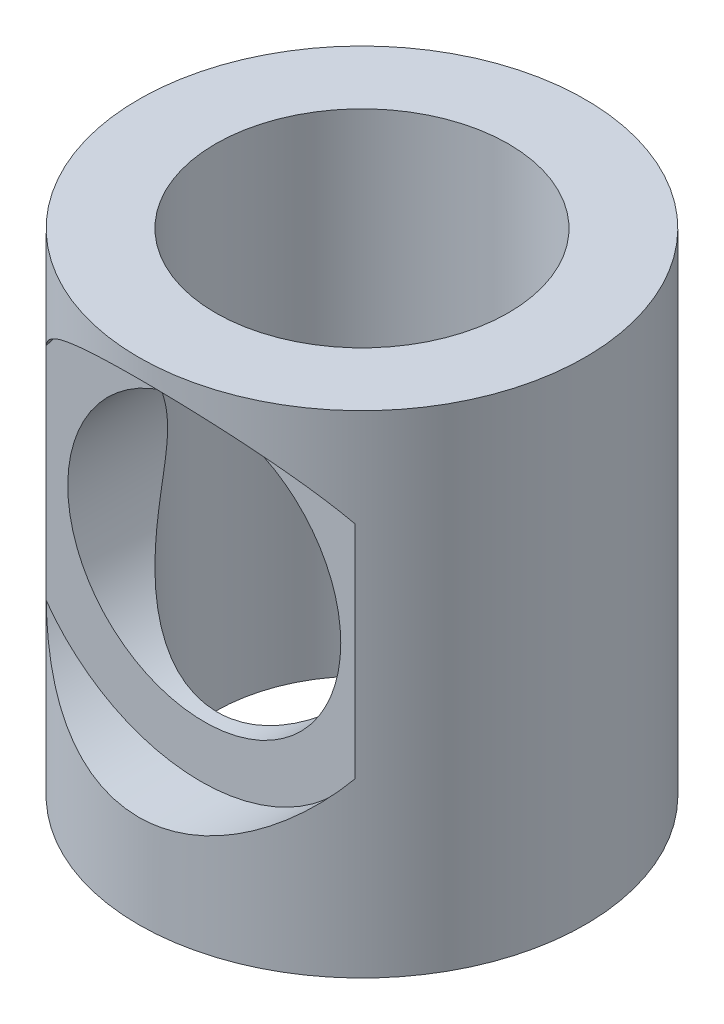
ISO-10303-21;
HEADER;
FILE_DESCRIPTION(('STEP AP214'),'2;1');
FILE_NAME('part.step','',(''),(''),'','','');
FILE_SCHEMA(('AUTOMOTIVE_DESIGN { 1 0 10303 214 1 1 1 1 }'));
ENDSEC;
DATA;
#1=APPLICATION_CONTEXT('core data for automotive mechanical design processes');
#2=APPLICATION_PROTOCOL_DEFINITION('international standard','automotive_design',2000,#1);
#3=PRODUCT_CONTEXT('',#1,'mechanical');
#4=PRODUCT('Part','Part','',(#3));
#5=PRODUCT_RELATED_PRODUCT_CATEGORY('part','',(#4));
#6=PRODUCT_DEFINITION_FORMATION('','',#4);
#7=PRODUCT_DEFINITION_CONTEXT('part definition',#1,'design');
#8=PRODUCT_DEFINITION('design','',#6,#7);
#9=PRODUCT_DEFINITION_SHAPE('','',#8);
#10=(LENGTH_UNIT() NAMED_UNIT(*) SI_UNIT(.MILLI.,.METRE.));
#11=(NAMED_UNIT(*) PLANE_ANGLE_UNIT() SI_UNIT($,.RADIAN.));
#12=(NAMED_UNIT(*) SI_UNIT($,.STERADIAN.) SOLID_ANGLE_UNIT());
#13=UNCERTAINTY_MEASURE_WITH_UNIT(LENGTH_MEASURE(1.E-05),#10,'distance_accuracy_value','');
#14=(GEOMETRIC_REPRESENTATION_CONTEXT(3) GLOBAL_UNCERTAINTY_ASSIGNED_CONTEXT((#13)) GLOBAL_UNIT_ASSIGNED_CONTEXT((#10,
#11,#12)) REPRESENTATION_CONTEXT('',''));
#15=CARTESIAN_POINT('',(0.,0.,0.));
#16=DIRECTION('',(0.,0.,1.));
#17=DIRECTION('',(1.,0.,0.));
#18=AXIS2_PLACEMENT_3D('',#15,#16,#17);
#19=CARTESIAN_POINT('',(0.,-19.8,0.));
#20=DIRECTION('',(0.,1.,0.));
#21=DIRECTION('',(0.,0.,1.));
#22=AXIS2_PLACEMENT_3D('',#19,#20,#21);
#23=CYLINDRICAL_SURFACE('',#22,5.9);
#24=CARTESIAN_POINT('',(0.,-19.8,0.));
#25=DIRECTION('',(0.,1.,0.));
#26=DIRECTION('',(0.,0.,1.));
#27=AXIS2_PLACEMENT_3D('',#24,#25,#26);
#28=CIRCLE('',#27,5.9);
#29=CARTESIAN_POINT('',(0.,-19.8,5.9));
#30=VERTEX_POINT('',#29);
#31=EDGE_CURVE('E79',#30,#30,#28,.T.);
#32=ORIENTED_EDGE('',*,*,#31,.F.);
#33=EDGE_LOOP('',(#32));
#34=FACE_BOUND('',#33,.T.);
#35=CARTESIAN_POINT('',(0.,0.,0.));
#36=DIRECTION('',(0.,1.,0.));
#37=DIRECTION('',(0.,0.,1.));
#38=AXIS2_PLACEMENT_3D('',#35,#36,#37);
#39=CIRCLE('',#38,5.9);
#40=CARTESIAN_POINT('',(0.,0.,5.9));
#41=VERTEX_POINT('',#40);
#42=EDGE_CURVE('E76',#41,#41,#39,.T.);
#43=ORIENTED_EDGE('',*,*,#42,.T.);
#44=EDGE_LOOP('',(#43));
#45=FACE_BOUND('',#44,.T.);
#46=CARTESIAN_POINT('',(0.,-13.8980757264155,5.9));
#47=CARTESIAN_POINT('',(-0.126691390947467,-13.8947225584826,5.89999903100118));
#48=CARTESIAN_POINT('',(-0.253283101886937,-13.8869831277355,5.89591047329306));
#49=CARTESIAN_POINT('',(-0.505172197858989,-13.8628453528029,5.87968911101895));
#50=CARTESIAN_POINT('',(-0.630468852261912,-13.8464423666288,5.86755199309081));
#51=CARTESIAN_POINT('',(-0.878877969457032,-13.8052359922776,5.83551906602363));
#52=CARTESIAN_POINT('',(-1.0019864227693,-13.7804185812953,5.81561029683759));
#53=CARTESIAN_POINT('',(-1.24494416961968,-13.7228122654682,5.76848668659436));
#54=CARTESIAN_POINT('',(-1.36479187193238,-13.6900195436375,5.74126834652262));
#55=CARTESIAN_POINT('',(-1.5994993378932,-13.6172822427277,5.68033305523673));
#56=CARTESIAN_POINT('',(-1.71439084594245,-13.5773957633308,5.64666873831866));
#57=CARTESIAN_POINT('',(-1.93962666386801,-13.4908666705345,5.57332039064358));
#58=CARTESIAN_POINT('',(-2.04996927600559,-13.4442215634841,5.53363413778766));
#59=CARTESIAN_POINT('',(-2.37342839938266,-13.2950387207805,5.40651455204672));
#60=CARTESIAN_POINT('',(-2.57919622538723,-13.1831837187117,5.31096141279213));
#61=CARTESIAN_POINT('',(-2.91147259148078,-12.9750932471056,5.1339745229345));
#62=CARTESIAN_POINT('',(-3.0435030636337,-12.8839273823971,5.05664340791624));
#63=CARTESIAN_POINT('',(-3.29664336667831,-12.6926624994763,4.89536861163123));
#64=CARTESIAN_POINT('',(-3.41775234376699,-12.592562784063,4.81142441433707));
#65=CARTESIAN_POINT('',(-3.64931102085374,-12.3842095670769,4.63826423635226));
#66=CARTESIAN_POINT('',(-3.75973329166726,-12.2759362903161,4.54903559049138));
#67=CARTESIAN_POINT('',(-3.96973078717574,-12.0522056789811,4.36698286270553));
#68=CARTESIAN_POINT('',(-4.06930758591977,-11.9367493907396,4.27415930518318));
#69=CARTESIAN_POINT('',(-4.26013854697353,-11.6961669363625,4.08409036890311));
#70=CARTESIAN_POINT('',(-4.351128096397,-11.5708728767048,3.98679238231184));
#71=CARTESIAN_POINT('',(-4.5221398232079,-11.3132924915922,3.79171109998188));
#72=CARTESIAN_POINT('',(-4.60215846382999,-11.181003930228,3.69392765822147));
#73=CARTESIAN_POINT('',(-4.751105074448,-10.9094687707432,3.50026870357882));
#74=CARTESIAN_POINT('',(-4.82005535477877,-10.7702369303474,3.40438970288198));
#75=CARTESIAN_POINT('',(-4.94686434303035,-10.4838860329348,3.21733814288459));
#76=CARTESIAN_POINT('',(-5.00473144274456,-10.3367730521149,3.1261620612281));
#77=CARTESIAN_POINT('',(-5.10571315081887,-10.0424777774662,2.95815786242724));
#78=CARTESIAN_POINT('',(-5.1495100349538,-9.89584175114157,2.88079475682739));
#79=CARTESIAN_POINT('',(-5.22580654239033,-9.59315599461952,2.73995305396068));
#80=CARTESIAN_POINT('',(-5.25831937107675,-9.43711752062542,2.67645825952442));
#81=CARTESIAN_POINT('',(-5.30590206101214,-9.14219803289837,2.58066096353428));
#82=CARTESIAN_POINT('',(-5.32297825376607,-9.00480404442875,2.54491999429473));
#83=CARTESIAN_POINT('',(-5.34666640536932,-8.72541924559101,2.4947905696136));
#84=CARTESIAN_POINT('',(-5.35330523879007,-8.58344120472219,2.48034728194494));
#85=CARTESIAN_POINT('',(-5.3554380120879,-8.29840337038994,2.47574170447133));
#86=CARTESIAN_POINT('',(-5.35088724158274,-8.15534152168419,2.48567682331633));
#87=CARTESIAN_POINT('',(-5.33107684364997,-7.87322667224227,2.52786913650411));
#88=CARTESIAN_POINT('',(-5.31579236054983,-7.73418375762343,2.56017813882537));
#89=CARTESIAN_POINT('',(-5.26568803091204,-7.39396199152114,2.66214822610583));
#90=CARTESIAN_POINT('',(-5.22489652888435,-7.19694504315974,2.74243735681371));
#91=CARTESIAN_POINT('',(-5.15050018678506,-6.91261796838828,2.87838505710499));
#92=CARTESIAN_POINT('',(-5.1234155926985,-6.81949022492552,2.92642616484271));
#93=CARTESIAN_POINT('',(-5.06506210570554,-6.63662768357758,3.02629776669884));
#94=CARTESIAN_POINT('',(-5.03379423836005,-6.54689206098208,3.07812733064038));
#95=CARTESIAN_POINT('',(-4.93794034574231,-6.29277716334701,3.23119272709259));
#96=CARTESIAN_POINT('',(-4.86827349304077,-6.13229980667728,3.33572052318314));
#97=CARTESIAN_POINT('',(-4.7152872999393,-5.82064009200175,3.54870847502938));
#98=CARTESIAN_POINT('',(-4.63195743463648,-5.66946502419048,3.65717161170366));
#99=CARTESIAN_POINT('',(-4.45172407683618,-5.37586370996478,3.87454334546886));
#100=CARTESIAN_POINT('',(-4.35482509527568,-5.23343457858228,3.98345178288984));
#101=CARTESIAN_POINT('',(-4.14728300878044,-4.95732271290564,4.19910025047437));
#102=CARTESIAN_POINT('',(-4.03664633589044,-4.82363592983401,4.305841268398));
#103=CARTESIAN_POINT('',(-3.82225060262293,-4.58847312546911,4.49634739953033));
#104=CARTESIAN_POINT('',(-3.7207699287982,-4.48549799130277,4.5808215399314));
#105=CARTESIAN_POINT('',(-3.5081859743868,-4.28636517616412,4.7456031000575));
#106=CARTESIAN_POINT('',(-3.39708029073332,-4.19020920868762,4.82590947117037));
#107=CARTESIAN_POINT('',(-3.04958746303013,-3.91346003855873,5.05840288123673));
#108=CARTESIAN_POINT('',(-2.79847400994162,-3.74397197412195,5.20266888758936));
#109=CARTESIAN_POINT('',(-2.31939707558956,-3.4774332143989,5.42991805239152));
#110=CARTESIAN_POINT('',(-2.0988492179144,-3.37266083430901,5.51938982706541));
#111=CARTESIAN_POINT('',(-1.75346681644705,-3.23672873378699,5.63472583458447));
#112=CARTESIAN_POINT('',(-1.63587595899101,-3.19494664189632,5.67003347836915));
#113=CARTESIAN_POINT('',(-1.39643640524341,-3.11906689260189,5.73369756651343));
#114=CARTESIAN_POINT('',(-1.27458962128338,-3.08496583387809,5.76205708813489));
#115=CARTESIAN_POINT('',(-1.02642914804067,-3.02477284592739,5.81141748064538));
#116=CARTESIAN_POINT('',(-0.900088211618249,-2.99874486048158,5.83235977864427));
#117=CARTESIAN_POINT('',(-0.644816079342795,-2.95553567658093,5.86607048920778));
#118=CARTESIAN_POINT('',(-0.515884876998264,-2.93835450030006,5.87883888128502));
#119=CARTESIAN_POINT('',(-0.256628727299582,-2.91317344484187,5.89584679418353));
#120=CARTESIAN_POINT('',(-0.126304473087715,-2.90516919619632,5.90009037470147));
#121=CARTESIAN_POINT('',(0.134570384082555,-2.89846374825422,5.89990673019671));
#122=CARTESIAN_POINT('',(0.265120963356156,-2.89976162807223,5.89548036350674));
#123=CARTESIAN_POINT('',(0.509944551747424,-2.91088599492396,5.87904744875833));
#124=CARTESIAN_POINT('',(0.624330320420715,-2.91969402385821,5.86799114948268));
#125=CARTESIAN_POINT('',(0.851554907054138,-2.94431338744846,5.83934683986531));
#126=CARTESIAN_POINT('',(0.964393208556588,-2.96012700422569,5.82175670137976));
#127=CARTESIAN_POINT('',(1.18772091984133,-2.99846734151263,5.78032952414541));
#128=CARTESIAN_POINT('',(1.29821099714004,-3.02099212617462,5.75649428704467));
#129=CARTESIAN_POINT('',(1.51626805670346,-3.07238316692359,5.70294320674959));
#130=CARTESIAN_POINT('',(1.62383385664455,-3.10125194635073,5.6732250240664));
#131=CARTESIAN_POINT('',(1.94710605096148,-3.19850321228271,5.5740804292585));
#132=CARTESIAN_POINT('',(2.15734573511638,-3.27647129301467,5.49580634350663));
#133=CARTESIAN_POINT('',(2.55996188747735,-3.45340564497226,5.32024695343342));
#134=CARTESIAN_POINT('',(2.75233266080515,-3.55237857772415,5.22295561871366));
#135=CARTESIAN_POINT('',(3.21328548534353,-3.82370170819069,4.95856121540726));
#136=CARTESIAN_POINT('',(3.46953772732227,-4.00745948429896,4.78144909783368));
#137=CARTESIAN_POINT('',(3.82064480762622,-4.30526058171317,4.4983885996698));
#138=CARTESIAN_POINT('',(3.93233547729242,-4.40846293367087,4.40091228556977));
#139=CARTESIAN_POINT('',(4.14485786658105,-4.62143732248174,4.20135181742082));
#140=CARTESIAN_POINT('',(4.24569084040901,-4.73120859825464,4.09926819751325));
#141=CARTESIAN_POINT('',(4.46572556762391,-4.99081039552011,3.86019536984046));
#142=CARTESIAN_POINT('',(4.58121482471861,-5.14268794839389,3.72201513253257));
#143=CARTESIAN_POINT('',(4.79483928609781,-5.45562480564748,3.44245339950842));
#144=CARTESIAN_POINT('',(4.89296073498188,-5.61669125537365,3.30106946552355));
#145=CARTESIAN_POINT('',(5.0720837830056,-5.94766750821365,3.01857358439375));
#146=CARTESIAN_POINT('',(5.15312165929169,-6.1175575975365,2.87746170447889));
#147=CARTESIAN_POINT('',(5.26210506071957,-6.38033268894215,2.66953119159648));
#148=CARTESIAN_POINT('',(5.29632391422768,-6.4692032689628,2.60087588064233));
#149=CARTESIAN_POINT('',(5.36055081118167,-6.65008324521547,2.46578190434102));
#150=CARTESIAN_POINT('',(5.3905597751791,-6.74209194976523,2.39934275682806));
#151=CARTESIAN_POINT('',(5.45438710888136,-6.95725795297133,2.25119845991433));
#152=CARTESIAN_POINT('',(5.48676725058061,-7.08167894964736,2.17068659532502));
#153=CARTESIAN_POINT('',(5.54373799691619,-7.33882489097139,2.0207277414023));
#154=CARTESIAN_POINT('',(5.56833920204582,-7.47153823735748,1.95126575894525));
#155=CARTESIAN_POINT('',(5.60235784721011,-7.70582369723826,1.85081869858252));
#156=CARTESIAN_POINT('',(5.61411694556966,-7.80471272419475,1.81454765977168));
#157=CARTESIAN_POINT('',(5.63236253498839,-8.00714557901541,1.75710450686243));
#158=CARTESIAN_POINT('',(5.63886646016617,-8.11067280293574,1.73588249629568));
#159=CARTESIAN_POINT('',(5.64593306042015,-8.32146452785627,1.71278402355639));
#160=CARTESIAN_POINT('',(5.64642521360382,-8.42875860878039,1.71113719669991));
#161=CARTESIAN_POINT('',(5.64120459503882,-8.64158079426524,1.72825420496607));
#162=CARTESIAN_POINT('',(5.63548200982144,-8.74710583786528,1.74705032087022));
#163=CARTESIAN_POINT('',(5.61593642172226,-8.98522510231223,1.80901881049154));
#164=CARTESIAN_POINT('',(5.6001528319444,-9.11607488205908,1.85793983453696));
#165=CARTESIAN_POINT('',(5.56091024727042,-9.36936047401536,1.97229134199129));
#166=CARTESIAN_POINT('',(5.53741237504634,-9.49174978563494,2.03780505650657));
#167=CARTESIAN_POINT('',(5.49166270947923,-9.69446763094233,2.15742560275305));
#168=CARTESIAN_POINT('',(5.47107623178907,-9.77658176151331,2.20922201870926));
#169=CARTESIAN_POINT('',(5.42675614806134,-9.93788121687622,2.31595747377028));
#170=CARTESIAN_POINT('',(5.40302173311646,-10.0170657821632,2.37089731855365));
#171=CARTESIAN_POINT('',(5.32719033356342,-10.2511708772875,2.53891734407894));
#172=CARTESIAN_POINT('',(5.27051701902101,-10.4024188395071,2.65505774376672));
#173=CARTESIAN_POINT('',(5.14510243001443,-10.6977107502207,2.89064978692658));
#174=CARTESIAN_POINT('',(5.07633133353942,-10.8417357391121,3.01010898409478));
#175=CARTESIAN_POINT('',(4.92673378092428,-11.1230357227229,3.24917918187432));
#176=CARTESIAN_POINT('',(4.84591683411423,-11.2603159293103,3.36878998960871));
#177=CARTESIAN_POINT('',(4.66802133547856,-11.5343968333393,3.61154127442111));
#178=CARTESIAN_POINT('',(4.57037870210778,-11.6709036737133,3.73460158701644));
#179=CARTESIAN_POINT('',(4.36113093072821,-11.9365017467917,3.97695699111887));
#180=CARTESIAN_POINT('',(4.24952102357247,-12.0655904244786,4.09625077903329));
#181=CARTESIAN_POINT('',(4.01229337178798,-12.3150004170543,4.32885594308744));
#182=CARTESIAN_POINT('',(3.88672205841016,-12.4353487153472,4.44218540545185));
#183=CARTESIAN_POINT('',(3.6210119118736,-12.6663415917789,4.66132658827157));
#184=CARTESIAN_POINT('',(3.48087532691496,-12.7769876626435,4.76713946470584));
#185=CARTESIAN_POINT('',(3.1321289713125,-13.0250065530019,5.00590008997567));
#186=CARTESIAN_POINT('',(2.91710548283167,-13.1575395604186,5.13479025500944));
#187=CARTESIAN_POINT('',(2.57493725188761,-13.33602144676,5.31000663365068));
#188=CARTESIAN_POINT('',(2.45757965089976,-13.3921397447167,5.36540297570773));
#189=CARTESIAN_POINT('',(2.21663840351633,-13.496813676423,5.46934139639484));
#190=CARTESIAN_POINT('',(2.09305792459577,-13.5453731071898,5.51788691522073));
#191=CARTESIAN_POINT('',(1.85879147884497,-13.6275829066349,5.60071330137401));
#192=CARTESIAN_POINT('',(1.74887495004753,-13.6623754348526,5.63604205147952));
#193=CARTESIAN_POINT('',(1.52544851796634,-13.7253295258297,5.70057145680351));
#194=CARTESIAN_POINT('',(1.41194041270075,-13.7534943487879,5.72977512420665));
#195=CARTESIAN_POINT('',(1.18212407111223,-13.8026980164112,5.78155970268008));
#196=CARTESIAN_POINT('',(1.06582120701582,-13.8237495182291,5.80415236739224));
#197=CARTESIAN_POINT('',(0.831024690370131,-13.8583966708997,5.84239113912954));
#198=CARTESIAN_POINT('',(0.712532054968926,-13.8719956977004,5.85804039088658));
#199=CARTESIAN_POINT('',(0.495052314228001,-13.8897660775923,5.88002490873621));
#200=CARTESIAN_POINT('',(0.396279518059513,-13.8951705780384,5.88751067875549));
#201=CARTESIAN_POINT('',(0.198317520745726,-13.9006377077734,5.8974990523467));
#202=CARTESIAN_POINT('',(0.0991282478077505,-13.9006993747889,5.90000075818218));
#203=CARTESIAN_POINT('',(0.,-13.8980757264155,5.9));
#204=B_SPLINE_CURVE_WITH_KNOTS('',3,(#46,#47,#48,#49,#50,#51,#52,#53,#54,#55,#56,#57,#58,#59,
#60,#61,#62,#63,#64,#65,#66,#67,#68,#69,#70,#71,#72,#73,#74,#75,#76,#77,#78,#79,#80,#81,#82,#83,
#84,#85,#86,#87,#88,#89,#90,#91,#92,#93,#94,#95,#96,#97,#98,#99,#100,#101,#102,#103,#104,#105,
#106,#107,#108,#109,#110,#111,#112,#113,#114,#115,#116,#117,#118,#119,#120,#121,#122,#123,#124,
#125,#126,#127,#128,#129,#130,#131,#132,#133,#134,#135,#136,#137,#138,#139,#140,#141,#142,#143,
#144,#145,#146,#147,#148,#149,#150,#151,#152,#153,#154,#155,#156,#157,#158,#159,#160,#161,#162,
#163,#164,#165,#166,#167,#168,#169,#170,#171,#172,#173,#174,#175,#176,#177,#178,#179,#180,#181,
#182,#183,#184,#185,#186,#187,#188,#189,#190,#191,#192,#193,#194,#195,#196,#197,#198,#199,#200,
#201,#202,#203),.UNSPECIFIED.,.T.,.F.,(4,2,2,2,2,2,2,2,2,2,2,2,2,2,2,2,2,2,2,2,2,2,2,2,2,2,2,2,
2,2,2,2,2,2,2,2,2,2,2,2,2,2,2,2,2,2,2,2,2,2,2,2,2,2,2,2,2,2,2,2,2,2,2,2,2,2,2,2,2,2,2,2,2,2,2,2,
2,2,4),(0.,0.380096169429253,0.760396203745714,1.14133315643034,1.52245278566189,
1.90058376599133,2.27885461778552,3.03468921410489,3.56840720728952,4.10216688851362,
4.63726210898069,5.17227956504513,5.72044291410659,6.26878256481848,6.8160026667239,
7.3628067805401,7.87641915580811,8.38942842329582,8.8167568654834,9.2429831909629,
9.67091535758037,10.0998417529761,10.7458196176282,11.0704339653942,11.394968876843,
12.005472245784,12.6164481268954,13.227221374362,13.837709725961,14.3395839499393,
14.8415838394965,15.8427136043933,16.6195751912794,17.0082340010801,17.3967203648944,
17.7882095268259,18.179699669996,18.5710033329912,18.9622682585231,19.3076291898461,
19.6531027078289,19.9984766697096,20.3439882544175,21.053524298893,21.7632857043983,
22.8417939617691,23.3833373971348,23.9248182099103,24.630631734447,25.3370017899855,
26.0418564056183,26.3939467512397,26.7459599869496,27.20055268072,27.6545231963187,
27.9715452411546,28.287511191723,28.6071801114426,28.9273545437264,29.3467407081044,
29.768273739554,30.0658559162243,30.3635147095631,30.9596369786713,31.5572498731109,
32.1543934697465,32.7781414373988,33.4021029688482,34.0240481928658,34.6458975596515,
35.4930355883012,35.9168002826714,36.3403514171739,36.7017403976591,37.0629512358848,
37.4235159234613,37.7839171410527,38.0812655414982,38.3786674959024),.UNSPECIFIED.);
#205=CARTESIAN_POINT('',(0.,-13.8980757264155,5.9));
#206=VERTEX_POINT('',#205);
#207=EDGE_CURVE('E81',#206,#206,#204,.T.);
#208=ORIENTED_EDGE('',*,*,#207,.F.);
#209=EDGE_LOOP('',(#208));
#210=FACE_BOUND('',#209,.T.);
#211=ADVANCED_FACE('F38',(#34,#45,#210),#23,.F.);
#212=CARTESIAN_POINT('',(0.,-19.8,0.));
#213=DIRECTION('',(0.,1.,0.));
#214=DIRECTION('',(0.,0.,1.));
#215=AXIS2_PLACEMENT_3D('',#212,#213,#214);
#216=CYLINDRICAL_SURFACE('',#215,9.);
#217=CARTESIAN_POINT('',(0.,-19.8,0.));
#218=DIRECTION('',(0.,1.,0.));
#219=DIRECTION('',(0.,0.,1.));
#220=AXIS2_PLACEMENT_3D('',#217,#218,#219);
#221=CIRCLE('',#220,9.);
#222=CARTESIAN_POINT('',(0.,-19.8,9.));
#223=VERTEX_POINT('',#222);
#224=EDGE_CURVE('E92',#223,#223,#221,.T.);
#225=ORIENTED_EDGE('',*,*,#224,.T.);
#226=EDGE_LOOP('',(#225));
#227=FACE_BOUND('',#226,.T.);
#228=CARTESIAN_POINT('',(0.,0.,0.));
#229=DIRECTION('',(0.,1.,0.));
#230=DIRECTION('',(0.,0.,1.));
#231=AXIS2_PLACEMENT_3D('',#228,#229,#230);
#232=CIRCLE('',#231,9.);
#233=CARTESIAN_POINT('',(0.,0.,9.));
#234=VERTEX_POINT('',#233);
#235=EDGE_CURVE('E90',#234,#234,#232,.T.);
#236=ORIENTED_EDGE('',*,*,#235,.F.);
#237=EDGE_LOOP('',(#236));
#238=FACE_BOUND('',#237,.T.);
#239=CARTESIAN_POINT('',(-6.22494979899437,-3.95337206413669,6.5));
#240=CARTESIAN_POINT('',(-6.16134895331716,-3.86434266528354,6.56091095855703));
#241=CARTESIAN_POINT('',(-6.0958583891841,-3.77669190032849,6.62183887781584));
#242=CARTESIAN_POINT('',(-5.96107696732273,-3.60416218238943,6.74342617047551));
#243=CARTESIAN_POINT('',(-5.89178593952,-3.51928335372387,6.80408553172665));
#244=CARTESIAN_POINT('',(-5.6780312028604,-3.26865256219262,6.98533319888477));
#245=CARTESIAN_POINT('',(-5.52782731561727,-3.1071045464631,7.10505415115098));
#246=CARTESIAN_POINT('',(-5.21080152474896,-2.79464540352697,7.34077063418253));
#247=CARTESIAN_POINT('',(-5.04385000619753,-2.64383561476081,7.45672617039017));
#248=CARTESIAN_POINT('',(-4.69446487048112,-2.35551934304975,7.68147793110335));
#249=CARTESIAN_POINT('',(-4.51203985859151,-2.21800555568427,7.79027807593569));
#250=CARTESIAN_POINT('',(-4.17266754314741,-1.98563399761434,7.97607880809));
#251=CARTESIAN_POINT('',(-4.01864288156205,-1.88795175773062,8.05489611536718));
#252=CARTESIAN_POINT('',(-3.70143650603726,-1.70256777348788,8.20549669217375));
#253=CARTESIAN_POINT('',(-3.53825692165807,-1.61486372232014,8.2772815869569));
#254=CARTESIAN_POINT('',(-3.20361752687017,-1.45061301751286,8.41244966201882));
#255=CARTESIAN_POINT('',(-3.03218060895157,-1.37403764200971,8.47585443068598));
#256=CARTESIAN_POINT('',(-2.68133955596,-1.23280600271412,8.59328987490824));
#257=CARTESIAN_POINT('',(-2.50193544079964,-1.16814970913412,8.64732057389052));
#258=CARTESIAN_POINT('',(-2.13427287057132,-1.05119268321981,8.74536685942876));
#259=CARTESIAN_POINT('',(-1.94594195795108,-0.999026845954322,8.78927292941695));
#260=CARTESIAN_POINT('',(-1.56355401054903,-0.908913590406122,8.86528563337414));
#261=CARTESIAN_POINT('',(-1.36949690894912,-0.870966338108882,8.89739212959674));
#262=CARTESIAN_POINT('',(-0.977429764550202,-0.810107271620347,8.94895021819504));
#263=CARTESIAN_POINT('',(-0.7794209423887,-0.787190886440451,8.96840565782732));
#264=CARTESIAN_POINT('',(-0.381378050919113,-0.756907117844238,8.99412605970429));
#265=CARTESIAN_POINT('',(-0.181344312429017,-0.749537234455248,9.00039314271708));
#266=CARTESIAN_POINT('',(0.189066377481258,-0.750436429989282,8.99962921178908));
#267=CARTESIAN_POINT('',(0.359458469906313,-0.756555782826409,8.99442614210154));
#268=CARTESIAN_POINT('',(0.698894301640701,-0.780093031693656,8.97443273684066));
#269=CARTESIAN_POINT('',(0.867938069175353,-0.797510690577635,8.95964260249531));
#270=CARTESIAN_POINT('',(1.20339446308161,-0.843347462123487,8.92078193229801));
#271=CARTESIAN_POINT('',(1.36980771031539,-0.87176393721004,8.89671362140832));
#272=CARTESIAN_POINT('',(1.69894301858589,-0.939147732795099,8.83976768026059));
#273=CARTESIAN_POINT('',(1.86166493136957,-0.978115476248179,8.80688969686156));
#274=CARTESIAN_POINT('',(2.18009147646861,-1.06538726464849,8.73346979960461));
#275=CARTESIAN_POINT('',(2.33586436916241,-1.11354437131452,8.69304869920528));
#276=CARTESIAN_POINT('',(2.64218608000161,-1.21893981756778,8.6048995533528));
#277=CARTESIAN_POINT('',(2.79273339189256,-1.27618074947308,8.55716942220446));
#278=CARTESIAN_POINT('',(3.23578128588798,-1.46065942177288,8.40399931712716));
#279=CARTESIAN_POINT('',(3.51969595571954,-1.60065531113814,8.28857770319577));
#280=CARTESIAN_POINT('',(3.98506215597238,-1.86607362212867,8.07251847286217));
#281=CARTESIAN_POINT('',(4.17292265529351,-1.98457635040137,7.97680959678669));
#282=CARTESIAN_POINT('',(4.5346885239896,-2.23498218097565,7.77684101325969));
#283=CARTESIAN_POINT('',(4.70859308347794,-2.36688605996343,7.67258081026922));
#284=CARTESIAN_POINT('',(5.04227965073812,-2.64284333333132,7.45753752933202));
#285=CARTESIAN_POINT('',(5.20205301436366,-2.78690406029333,7.34675052698657));
#286=CARTESIAN_POINT('',(5.50731642037851,-3.08609240139971,7.12077885229499));
#287=CARTESIAN_POINT('',(5.65281316717223,-3.24121476124892,7.0055962797801));
#288=CARTESIAN_POINT('',(5.86795324223616,-3.4904764229606,6.82474781071756));
#289=CARTESIAN_POINT('',(5.94251443298016,-3.58099928974672,6.759880633005));
#290=CARTESIAN_POINT('',(6.08707590851366,-3.76495625892509,6.63000197691167));
#291=CARTESIAN_POINT('',(6.15708892627183,-3.8583810462425,6.56499147943313));
#292=CARTESIAN_POINT('',(6.22494979899437,-3.95337206413669,6.5));
#293=B_SPLINE_CURVE_WITH_KNOTS('',3,(#239,#240,#241,#242,#243,#244,#245,#246,#247,#248,#249,
#250,#251,#252,#253,#254,#255,#256,#257,#258,#259,#260,#261,#262,#263,#264,#265,#266,#267,#268,
#269,#270,#271,#272,#273,#274,#275,#276,#277,#278,#279,#280,#281,#282,#283,#284,#285,#286,#287,
#288,#289,#290,#291,#292),.UNSPECIFIED.,.F.,.F.,(4,2,2,2,2,2,2,2,2,2,2,2,2,2,2,2,2,2,2,2,2,2,2,
2,2,2,4),(0.,0.375629926240317,0.751276676017923,1.5034062606236,2.26188693980813,
3.01994853649186,3.61548939535621,4.21089229306136,4.80473014126492,5.39856650535911,
5.99855292937193,6.59854635731137,7.19835723847895,7.79807165902937,8.30918030462657,
8.82027822264028,9.33125365248253,9.84224956814613,10.3456717589664,10.8492378742921,
11.8563443800742,12.5810734304056,13.305844507613,14.0310559093185,14.7559250999285,
15.1578912178923,15.5586786379522),.UNSPECIFIED.);
#294=CARTESIAN_POINT('',(-6.22494979899436,-3.95337206413669,6.5));
#295=VERTEX_POINT('',#294);
#296=CARTESIAN_POINT('',(6.22494979899436,-3.95337206413669,6.5));
#297=VERTEX_POINT('',#296);
#298=EDGE_CURVE('E48',#295,#297,#293,.T.);
#299=ORIENTED_EDGE('',*,*,#298,.T.);
#300=DIRECTION('',(0.,1.,0.));
#301=VECTOR('',#300,1.);
#302=CARTESIAN_POINT('',(6.22494979899437,-19.8,6.5));
#303=LINE('',#302,#301);
#304=CARTESIAN_POINT('',(6.22494979899436,-12.8466279358633,6.5));
#305=VERTEX_POINT('',#304);
#306=EDGE_CURVE('E12',#297,#305,#303,.F.);
#307=ORIENTED_EDGE('',*,*,#306,.T.);
#308=CARTESIAN_POINT('',(6.22494979899437,-12.8466279358633,6.5));
#309=CARTESIAN_POINT('',(6.16134895331716,-12.9356573347165,6.56091095855703));
#310=CARTESIAN_POINT('',(6.0958583891841,-13.0233080996715,6.62183887781584));
#311=CARTESIAN_POINT('',(5.96107696732273,-13.1958378176106,6.74342617047551));
#312=CARTESIAN_POINT('',(5.89178593952,-13.2807166462761,6.80408553172665));
#313=CARTESIAN_POINT('',(5.6780312028604,-13.5313474378074,6.98533319888477));
#314=CARTESIAN_POINT('',(5.52782731561726,-13.6928954535369,7.10505415115098));
#315=CARTESIAN_POINT('',(5.21080152474896,-14.005354596473,7.34077063418253));
#316=CARTESIAN_POINT('',(5.04385000619752,-14.1561643852392,7.45672617039017));
#317=CARTESIAN_POINT('',(4.69446487048112,-14.4444806569503,7.68147793110335));
#318=CARTESIAN_POINT('',(4.5120398585915,-14.5819944443157,7.7902780759357));
#319=CARTESIAN_POINT('',(4.17266754314741,-14.8143660023857,7.97607880809));
#320=CARTESIAN_POINT('',(4.01864288156205,-14.9120482422694,8.05489611536718));
#321=CARTESIAN_POINT('',(3.70143650603726,-15.0974322265121,8.20549669217374));
#322=CARTESIAN_POINT('',(3.53825692165807,-15.1851362776799,8.2772815869569));
#323=CARTESIAN_POINT('',(3.20361752687017,-15.3493869824871,8.41244966201882));
#324=CARTESIAN_POINT('',(3.03218060895157,-15.4259623579903,8.47585443068598));
#325=CARTESIAN_POINT('',(2.68133955596,-15.5671939972859,8.59328987490824));
#326=CARTESIAN_POINT('',(2.50193544079964,-15.6318502908659,8.64732057389052));
#327=CARTESIAN_POINT('',(2.13427287057132,-15.7488073167802,8.74536685942876));
#328=CARTESIAN_POINT('',(1.94594195795109,-15.8009731540457,8.78927292941695));
#329=CARTESIAN_POINT('',(1.56355401054903,-15.8910864095939,8.86528563337414));
#330=CARTESIAN_POINT('',(1.36949690894912,-15.9290336618911,8.89739212959674));
#331=CARTESIAN_POINT('',(0.977429764550203,-15.9898927283797,8.94895021819504));
#332=CARTESIAN_POINT('',(0.779420942388701,-16.0128091135596,8.96840565782732));
#333=CARTESIAN_POINT('',(0.381378050919116,-16.0430928821558,8.99412605970429));
#334=CARTESIAN_POINT('',(0.18134431242902,-16.0504627655448,9.00039314271708));
#335=CARTESIAN_POINT('',(-0.189066377481255,-16.0495635700107,8.99962921178908));
#336=CARTESIAN_POINT('',(-0.35945846990631,-16.0434442171736,8.99442614210154));
#337=CARTESIAN_POINT('',(-0.698894301640697,-16.0199069683063,8.97443273684066));
#338=CARTESIAN_POINT('',(-0.867938069175349,-16.0024893094224,8.95964260249531));
#339=CARTESIAN_POINT('',(-1.20339446308161,-15.9566525378765,8.92078193229801));
#340=CARTESIAN_POINT('',(-1.36980771031539,-15.92823606279,8.89671362140832));
#341=CARTESIAN_POINT('',(-1.69894301858588,-15.8608522672049,8.83976768026059));
#342=CARTESIAN_POINT('',(-1.86166493136956,-15.8218845237518,8.80688969686156));
#343=CARTESIAN_POINT('',(-2.18009147646861,-15.7346127353515,8.73346979960461));
#344=CARTESIAN_POINT('',(-2.3358643691624,-15.6864556286855,8.69304869920528));
#345=CARTESIAN_POINT('',(-2.64218608000161,-15.5810601824322,8.60489955335281));
#346=CARTESIAN_POINT('',(-2.79273339189256,-15.5238192505269,8.55716942220446));
#347=CARTESIAN_POINT('',(-3.23578128588798,-15.3393405782271,8.40399931712716));
#348=CARTESIAN_POINT('',(-3.51969595571953,-15.1993446888619,8.28857770319577));
#349=CARTESIAN_POINT('',(-3.98506215597237,-14.9339263778713,8.07251847286217));
#350=CARTESIAN_POINT('',(-4.17292265529351,-14.8154236495986,7.97680959678669));
#351=CARTESIAN_POINT('',(-4.53468852398959,-14.5650178190244,7.77684101325969));
#352=CARTESIAN_POINT('',(-4.70859308347794,-14.4331139400366,7.67258081026922));
#353=CARTESIAN_POINT('',(-5.04227965073812,-14.1571566666687,7.45753752933202));
#354=CARTESIAN_POINT('',(-5.20205301436366,-14.0130959397067,7.34675052698657));
#355=CARTESIAN_POINT('',(-5.50731642037851,-13.7139075986003,7.12077885229499));
#356=CARTESIAN_POINT('',(-5.65281316717223,-13.5587852387511,7.0055962797801));
#357=CARTESIAN_POINT('',(-5.86795324223616,-13.3095235770394,6.82474781071757));
#358=CARTESIAN_POINT('',(-5.94251443298016,-13.2190007102533,6.759880633005));
#359=CARTESIAN_POINT('',(-6.08707590851366,-13.0350437410749,6.63000197691167));
#360=CARTESIAN_POINT('',(-6.15708892627183,-12.9416189537575,6.56499147943313));
#361=CARTESIAN_POINT('',(-6.22494979899437,-12.8466279358633,6.5));
#362=B_SPLINE_CURVE_WITH_KNOTS('',3,(#308,#309,#310,#311,#312,#313,#314,#315,#316,#317,#318,
#319,#320,#321,#322,#323,#324,#325,#326,#327,#328,#329,#330,#331,#332,#333,#334,#335,#336,#337,
#338,#339,#340,#341,#342,#343,#344,#345,#346,#347,#348,#349,#350,#351,#352,#353,#354,#355,#356,
#357,#358,#359,#360,#361),.UNSPECIFIED.,.F.,.F.,(4,2,2,2,2,2,2,2,2,2,2,2,2,2,2,2,2,2,2,2,2,2,2,
2,2,2,4),(0.,0.375629926240318,0.751276676017925,1.5034062606236,2.26188693980813,
3.01994853649186,3.61548939535621,4.21089229306136,4.80473014126492,5.39856650535911,
5.99855292937193,6.59854635731137,7.19835723847895,7.79807165902936,8.30918030462657,
8.82027822264028,9.33125365248253,9.84224956814613,10.3456717589664,10.8492378742921,
11.8563443800742,12.5810734304056,13.305844507613,14.0310559093185,14.7559250999285,
15.1578912178923,15.5586786379522),.UNSPECIFIED.);
#363=CARTESIAN_POINT('',(-6.22494979899436,-12.8466279358633,6.5));
#364=VERTEX_POINT('',#363);
#365=EDGE_CURVE('E62',#305,#364,#362,.T.);
#366=ORIENTED_EDGE('',*,*,#365,.T.);
#367=DIRECTION('',(0.,1.,0.));
#368=VECTOR('',#367,1.);
#369=CARTESIAN_POINT('',(-6.22494979899437,-19.8,6.5));
#370=LINE('',#369,#368);
#371=EDGE_CURVE('E70',#364,#295,#370,.T.);
#372=ORIENTED_EDGE('',*,*,#371,.T.);
#373=EDGE_LOOP('',(#299,#307,#366,#372));
#374=FACE_BOUND('',#373,.T.);
#375=ADVANCED_FACE('F40',(#227,#238,#374),#216,.T.);
#376=CARTESIAN_POINT('',(0.,-19.8,0.));
#377=DIRECTION('',(0.,1.,0.));
#378=DIRECTION('',(0.,0.,1.));
#379=AXIS2_PLACEMENT_3D('',#376,#377,#378);
#380=PLANE('',#379);
#381=ORIENTED_EDGE('',*,*,#31,.T.);
#382=EDGE_LOOP('',(#381));
#383=FACE_BOUND('',#382,.T.);
#384=ORIENTED_EDGE('',*,*,#224,.F.);
#385=EDGE_LOOP('',(#384));
#386=FACE_BOUND('',#385,.T.);
#387=ADVANCED_FACE('F116',(#383,#386),#380,.F.);
#388=CARTESIAN_POINT('',(0.,0.,0.));
#389=DIRECTION('',(0.,1.,0.));
#390=DIRECTION('',(0.,0.,1.));
#391=AXIS2_PLACEMENT_3D('',#388,#389,#390);
#392=PLANE('',#391);
#393=ORIENTED_EDGE('',*,*,#42,.F.);
#394=EDGE_LOOP('',(#393));
#395=FACE_BOUND('',#394,.T.);
#396=ORIENTED_EDGE('',*,*,#235,.T.);
#397=EDGE_LOOP('',(#396));
#398=FACE_BOUND('',#397,.T.);
#399=ADVANCED_FACE('F118',(#395,#398),#392,.T.);
#400=CARTESIAN_POINT('',(0.,-8.4,9.));
#401=DIRECTION('',(0.,0.,-1.));
#402=DIRECTION('',(-1.,0.,0.));
#403=AXIS2_PLACEMENT_3D('',#400,#401,#402);
#404=CYLINDRICAL_SURFACE('',#403,7.65);
#405=CARTESIAN_POINT('',(0.,-8.4,6.5));
#406=DIRECTION('',(0.,0.,1.));
#407=DIRECTION('',(1.,0.,0.));
#408=AXIS2_PLACEMENT_3D('',#405,#406,#407);
#409=CIRCLE('',#408,7.65);
#410=EDGE_CURVE('E55',#297,#295,#409,.T.);
#411=ORIENTED_EDGE('',*,*,#410,.F.);
#412=ORIENTED_EDGE('',*,*,#298,.F.);
#413=EDGE_LOOP('',(#411,#412));
#414=FACE_BOUND('',#413,.T.);
#415=ADVANCED_FACE('F75',(#414),#404,.F.);
#416=EDGE_CURVE('E74',#364,#305,#409,.T.);
#417=ORIENTED_EDGE('',*,*,#416,.F.);
#418=ORIENTED_EDGE('',*,*,#365,.F.);
#419=EDGE_LOOP('',(#417,#418));
#420=FACE_BOUND('',#419,.T.);
#421=ADVANCED_FACE('F107',(#420),#404,.F.);
#422=CARTESIAN_POINT('',(0.,-8.4,6.5));
#423=DIRECTION('',(0.,0.,1.));
#424=DIRECTION('',(1.,0.,0.));
#425=AXIS2_PLACEMENT_3D('',#422,#423,#424);
#426=PLANE('',#425);
#427=CARTESIAN_POINT('',(0.1454761375661,-8.4,6.5));
#428=DIRECTION('',(0.,0.,1.));
#429=DIRECTION('',(1.,0.,0.));
#430=AXIS2_PLACEMENT_3D('',#427,#428,#429);
#431=CIRCLE('',#430,5.5);
#432=CARTESIAN_POINT('',(5.6454761375661,-8.4,6.5));
#433=VERTEX_POINT('',#432);
#434=EDGE_CURVE('E43',#433,#433,#431,.F.);
#435=ORIENTED_EDGE('',*,*,#434,.T.);
#436=EDGE_LOOP('',(#435));
#437=FACE_BOUND('',#436,.T.);
#438=ORIENTED_EDGE('',*,*,#410,.T.);
#439=ORIENTED_EDGE('',*,*,#371,.F.);
#440=ORIENTED_EDGE('',*,*,#416,.T.);
#441=ORIENTED_EDGE('',*,*,#306,.F.);
#442=EDGE_LOOP('',(#438,#439,#440,#441));
#443=FACE_BOUND('',#442,.T.);
#444=ADVANCED_FACE('F73',(#437,#443),#426,.T.);
#445=CARTESIAN_POINT('',(0.1454761375661,-8.4,9.));
#446=DIRECTION('',(0.,0.,-1.));
#447=DIRECTION('',(-1.,0.,0.));
#448=AXIS2_PLACEMENT_3D('',#445,#446,#447);
#449=CYLINDRICAL_SURFACE('',#448,5.5);
#450=ORIENTED_EDGE('',*,*,#434,.F.);
#451=EDGE_LOOP('',(#450));
#452=FACE_BOUND('',#451,.T.);
#453=ORIENTED_EDGE('',*,*,#207,.T.);
#454=EDGE_LOOP('',(#453));
#455=FACE_BOUND('',#454,.T.);
#456=ADVANCED_FACE('F167',(#452,#455),#449,.F.);
#457=CLOSED_SHELL('',(#211,#375,#387,#399,#415,#421,#444,#456));
#458=MANIFOLD_SOLID_BREP('B2',#457);
#459=ADVANCED_BREP_SHAPE_REPRESENTATION('',(#18,#458),#14);
#460=SHAPE_DEFINITION_REPRESENTATION(#9,#459);
ENDSEC;
END-ISO-10303-21;
